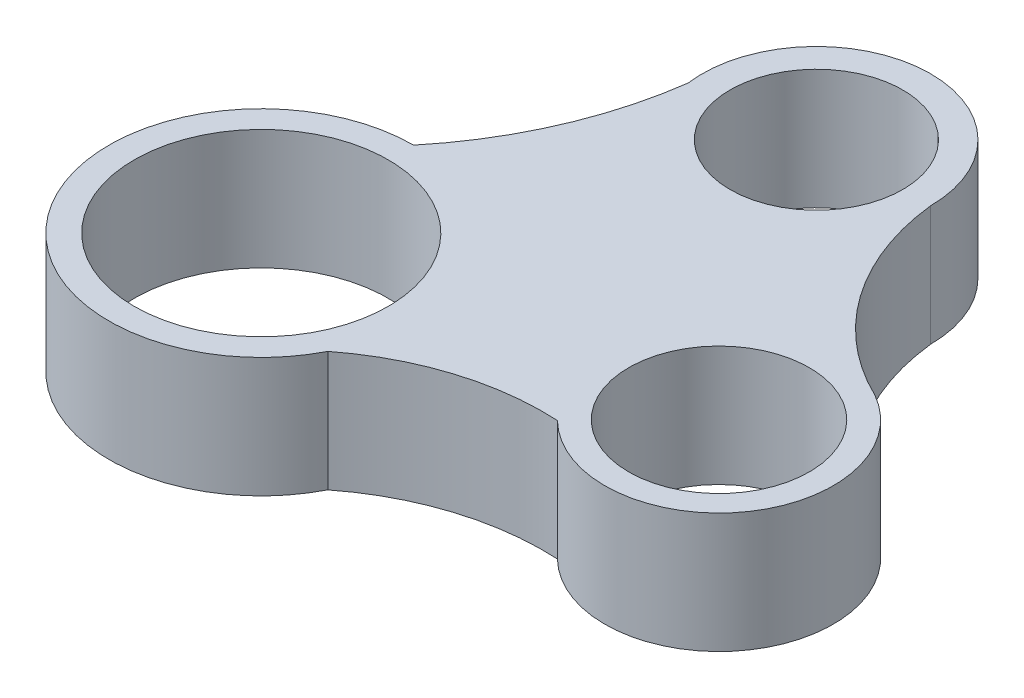
ISO-10303-21;
HEADER;
FILE_DESCRIPTION(('STEP AP214'),'2;1');
FILE_NAME('part.step','',(''),(''),'','','');
FILE_SCHEMA(('AUTOMOTIVE_DESIGN { 1 0 10303 214 1 1 1 1 }'));
ENDSEC;
DATA;
#1=APPLICATION_CONTEXT('core data for automotive mechanical design processes');
#2=APPLICATION_PROTOCOL_DEFINITION('international standard','automotive_design',2000,#1);
#3=PRODUCT_CONTEXT('',#1,'mechanical');
#4=PRODUCT('Part','Part','',(#3));
#5=PRODUCT_RELATED_PRODUCT_CATEGORY('part','',(#4));
#6=PRODUCT_DEFINITION_FORMATION('','',#4);
#7=PRODUCT_DEFINITION_CONTEXT('part definition',#1,'design');
#8=PRODUCT_DEFINITION('design','',#6,#7);
#9=PRODUCT_DEFINITION_SHAPE('','',#8);
#10=(LENGTH_UNIT() NAMED_UNIT(*) SI_UNIT(.MILLI.,.METRE.));
#11=(NAMED_UNIT(*) PLANE_ANGLE_UNIT() SI_UNIT($,.RADIAN.));
#12=(NAMED_UNIT(*) SI_UNIT($,.STERADIAN.) SOLID_ANGLE_UNIT());
#13=UNCERTAINTY_MEASURE_WITH_UNIT(LENGTH_MEASURE(1.E-05),#10,'distance_accuracy_value','');
#14=(GEOMETRIC_REPRESENTATION_CONTEXT(3) GLOBAL_UNCERTAINTY_ASSIGNED_CONTEXT((#13)) GLOBAL_UNIT_ASSIGNED_CONTEXT((#10,
#11,#12)) REPRESENTATION_CONTEXT('',''));
#15=CARTESIAN_POINT('',(0.,0.,0.));
#16=DIRECTION('',(0.,0.,1.));
#17=DIRECTION('',(1.,0.,0.));
#18=AXIS2_PLACEMENT_3D('',#15,#16,#17);
#19=CARTESIAN_POINT('',(-24.4218345166872,10.,-32.8570012060377));
#20=DIRECTION('',(0.,-1.,0.));
#21=DIRECTION('',(0.,0.,-1.));
#22=AXIS2_PLACEMENT_3D('',#19,#20,#21);
#23=CYLINDRICAL_SURFACE('',#22,31.6659233053556);
#24=CARTESIAN_POINT('',(-24.4218345166872,0.,-32.8570012060377));
#25=DIRECTION('',(0.,1.,0.));
#26=DIRECTION('',(0.,0.,1.));
#27=AXIS2_PLACEMENT_3D('',#24,#25,#26);
#28=CIRCLE('',#27,31.6659233053556);
#29=CARTESIAN_POINT('',(6.95939174308019,0.,-28.6203353926951));
#30=VERTEX_POINT('',#29);
#31=CARTESIAN_POINT('',(0.,0.,-12.7));
#32=VERTEX_POINT('',#31);
#33=EDGE_CURVE('E140',#30,#32,#28,.F.);
#34=ORIENTED_EDGE('',*,*,#33,.T.);
#35=DIRECTION('',(0.,-1.,0.));
#36=VECTOR('',#35,1.);
#37=CARTESIAN_POINT('',(0.,10.,-12.7));
#38=LINE('',#37,#36);
#39=CARTESIAN_POINT('',(0.,10.,-12.7));
#40=VERTEX_POINT('',#39);
#41=EDGE_CURVE('E11',#40,#32,#38,.T.);
#42=ORIENTED_EDGE('',*,*,#41,.F.);
#43=CARTESIAN_POINT('',(-24.4218345166872,10.,-32.8570012060377));
#44=DIRECTION('',(0.,1.,0.));
#45=DIRECTION('',(0.,0.,1.));
#46=AXIS2_PLACEMENT_3D('',#43,#44,#45);
#47=CIRCLE('',#46,31.6659233053556);
#48=CARTESIAN_POINT('',(6.95939174308019,10.,-28.6203353926951));
#49=VERTEX_POINT('',#48);
#50=EDGE_CURVE('E169',#49,#40,#47,.F.);
#51=ORIENTED_EDGE('',*,*,#50,.F.);
#52=DIRECTION('',(0.,-1.,0.));
#53=VECTOR('',#52,1.);
#54=CARTESIAN_POINT('',(6.95939174308019,10.,-28.6203353926951));
#55=LINE('',#54,#53);
#56=EDGE_CURVE('E139',#49,#30,#55,.T.);
#57=ORIENTED_EDGE('',*,*,#56,.T.);
#58=EDGE_LOOP('',(#34,#42,#51,#57));
#59=FACE_BOUND('',#58,.T.);
#60=ADVANCED_FACE('F39',(#59),#23,.F.);
#61=CARTESIAN_POINT('',(0.,10.,0.));
#62=DIRECTION('',(0.,-1.,0.));
#63=DIRECTION('',(0.,0.,-1.));
#64=AXIS2_PLACEMENT_3D('',#61,#62,#63);
#65=CYLINDRICAL_SURFACE('',#64,12.7);
#66=CARTESIAN_POINT('',(0.,0.,0.));
#67=DIRECTION('',(0.,1.,0.));
#68=DIRECTION('',(0.,0.,1.));
#69=AXIS2_PLACEMENT_3D('',#66,#67,#68);
#70=CIRCLE('',#69,12.7);
#71=CARTESIAN_POINT('',(11.3157903638749,0.,5.76566461397434));
#72=VERTEX_POINT('',#71);
#73=EDGE_CURVE('E144',#32,#72,#70,.T.);
#74=ORIENTED_EDGE('',*,*,#73,.T.);
#75=DIRECTION('',(0.,-1.,0.));
#76=VECTOR('',#75,1.);
#77=CARTESIAN_POINT('',(11.3157903638749,10.,5.76566461397434));
#78=LINE('',#77,#76);
#79=CARTESIAN_POINT('',(11.3157903638749,10.,5.76566461397434));
#80=VERTEX_POINT('',#79);
#81=EDGE_CURVE('E48',#80,#72,#78,.T.);
#82=ORIENTED_EDGE('',*,*,#81,.F.);
#83=CARTESIAN_POINT('',(0.,10.,0.));
#84=DIRECTION('',(0.,1.,0.));
#85=DIRECTION('',(0.,0.,1.));
#86=AXIS2_PLACEMENT_3D('',#83,#84,#85);
#87=CIRCLE('',#86,12.7);
#88=EDGE_CURVE('E89',#40,#80,#87,.T.);
#89=ORIENTED_EDGE('',*,*,#88,.F.);
#90=ORIENTED_EDGE('',*,*,#41,.T.);
#91=EDGE_LOOP('',(#74,#82,#89,#90));
#92=FACE_BOUND('',#91,.T.);
#93=ADVANCED_FACE('F203',(#92),#65,.T.);
#94=CARTESIAN_POINT('',(24.6946754383705,10.,22.8627472391993));
#95=DIRECTION('',(0.,-1.,0.));
#96=DIRECTION('',(0.,0.,-1.));
#97=AXIS2_PLACEMENT_3D('',#94,#95,#96);
#98=CYLINDRICAL_SURFACE('',#97,21.7095555028271);
#99=CARTESIAN_POINT('',(24.6946754383705,0.,22.8627472391993));
#100=DIRECTION('',(0.,1.,0.));
#101=DIRECTION('',(0.,0.,1.));
#102=AXIS2_PLACEMENT_3D('',#99,#100,#101);
#103=CIRCLE('',#102,21.7095555028271);
#104=CARTESIAN_POINT('',(25.8771808449846,0.,1.18542081056288));
#105=VERTEX_POINT('',#104);
#106=EDGE_CURVE('E147',#72,#105,#103,.F.);
#107=ORIENTED_EDGE('',*,*,#106,.T.);
#108=DIRECTION('',(0.,-1.,0.));
#109=VECTOR('',#108,1.);
#110=CARTESIAN_POINT('',(25.8771808449846,10.,1.18542081056288));
#111=LINE('',#110,#109);
#112=CARTESIAN_POINT('',(25.8771808449846,10.,1.18542081056288));
#113=VERTEX_POINT('',#112);
#114=EDGE_CURVE('E118',#113,#105,#111,.T.);
#115=ORIENTED_EDGE('',*,*,#114,.F.);
#116=CARTESIAN_POINT('',(24.6946754383705,10.,22.8627472391993));
#117=DIRECTION('',(0.,1.,0.));
#118=DIRECTION('',(0.,0.,1.));
#119=AXIS2_PLACEMENT_3D('',#116,#117,#118);
#120=CIRCLE('',#119,21.7095555028271);
#121=EDGE_CURVE('E103',#80,#113,#120,.F.);
#122=ORIENTED_EDGE('',*,*,#121,.F.);
#123=ORIENTED_EDGE('',*,*,#81,.T.);
#124=EDGE_LOOP('',(#107,#115,#122,#123));
#125=FACE_BOUND('',#124,.T.);
#126=ADVANCED_FACE('F179',(#125),#98,.F.);
#127=CARTESIAN_POINT('',(32.5599613547654,10.,-5.60177814468323));
#128=DIRECTION('',(0.,-1.,0.));
#129=DIRECTION('',(0.,0.,-1.));
#130=AXIS2_PLACEMENT_3D('',#127,#128,#129);
#131=CYLINDRICAL_SURFACE('',#130,9.525);
#132=CARTESIAN_POINT('',(32.5599613547654,0.,-5.60177814468323));
#133=DIRECTION('',(0.,1.,0.));
#134=DIRECTION('',(0.,0.,1.));
#135=AXIS2_PLACEMENT_3D('',#132,#133,#134);
#136=CIRCLE('',#135,9.525);
#137=CARTESIAN_POINT('',(37.2856847426142,0.,-13.8717940734187));
#138=VERTEX_POINT('',#137);
#139=EDGE_CURVE('E113',#105,#138,#136,.T.);
#140=ORIENTED_EDGE('',*,*,#139,.T.);
#141=DIRECTION('',(0.,-1.,0.));
#142=VECTOR('',#141,1.);
#143=CARTESIAN_POINT('',(37.2856847426142,10.,-13.8717940734187));
#144=LINE('',#143,#142);
#145=CARTESIAN_POINT('',(37.2856847426142,10.,-13.8717940734187));
#146=VERTEX_POINT('',#145);
#147=EDGE_CURVE('E110',#146,#138,#144,.T.);
#148=ORIENTED_EDGE('',*,*,#147,.F.);
#149=CARTESIAN_POINT('',(32.5599613547654,10.,-5.60177814468323));
#150=DIRECTION('',(0.,1.,0.));
#151=DIRECTION('',(0.,0.,1.));
#152=AXIS2_PLACEMENT_3D('',#149,#150,#151);
#153=CIRCLE('',#152,9.525);
#154=EDGE_CURVE('E96',#113,#146,#153,.T.);
#155=ORIENTED_EDGE('',*,*,#154,.F.);
#156=ORIENTED_EDGE('',*,*,#114,.T.);
#157=EDGE_LOOP('',(#140,#148,#155,#156));
#158=FACE_BOUND('',#157,.T.);
#159=ADVANCED_FACE('F111',(#158),#131,.T.);
#160=CARTESIAN_POINT('',(46.0414826946628,10.,-32.1199803910774));
#161=DIRECTION('',(0.,-1.,0.));
#162=DIRECTION('',(0.,0.,-1.));
#163=AXIS2_PLACEMENT_3D('',#160,#161,#162);
#164=CYLINDRICAL_SURFACE('',#163,20.2400667405294);
#165=CARTESIAN_POINT('',(46.0414826946628,0.,-32.1199803910774));
#166=DIRECTION('',(0.,1.,0.));
#167=DIRECTION('',(0.,0.,1.));
#168=AXIS2_PLACEMENT_3D('',#165,#166,#167);
#169=CIRCLE('',#168,20.2400667405294);
#170=CARTESIAN_POINT('',(25.9258374970823,0.,-29.879194826562));
#171=VERTEX_POINT('',#170);
#172=EDGE_CURVE('E152',#171,#138,#169,.T.);
#173=ORIENTED_EDGE('',*,*,#172,.F.);
#174=DIRECTION('',(0.,-1.,0.));
#175=VECTOR('',#174,1.);
#176=CARTESIAN_POINT('',(25.9258374970823,10.,-29.879194826562));
#177=LINE('',#176,#175);
#178=CARTESIAN_POINT('',(25.9258374970823,10.,-29.879194826562));
#179=VERTEX_POINT('',#178);
#180=EDGE_CURVE('E78',#179,#171,#177,.T.);
#181=ORIENTED_EDGE('',*,*,#180,.F.);
#182=CARTESIAN_POINT('',(46.0414826946628,10.,-32.1199803910774));
#183=DIRECTION('',(0.,1.,0.));
#184=DIRECTION('',(0.,0.,1.));
#185=AXIS2_PLACEMENT_3D('',#182,#183,#184);
#186=CIRCLE('',#185,20.2400667405294);
#187=EDGE_CURVE('E101',#179,#146,#186,.T.);
#188=ORIENTED_EDGE('',*,*,#187,.T.);
#189=ORIENTED_EDGE('',*,*,#147,.T.);
#190=EDGE_LOOP('',(#173,#181,#188,#189));
#191=FACE_BOUND('',#190,.T.);
#192=ADVANCED_FACE('F120',(#191),#164,.F.);
#193=CARTESIAN_POINT('',(32.5599613547654,10.,-5.60177814468323));
#194=DIRECTION('',(0.,-1.,0.));
#195=DIRECTION('',(0.,0.,-1.));
#196=AXIS2_PLACEMENT_3D('',#193,#194,#195);
#197=CYLINDRICAL_SURFACE('',#196,7.53178847796581);
#198=CARTESIAN_POINT('',(32.5599613547654,10.,-5.60177814468323));
#199=DIRECTION('',(0.,1.,0.));
#200=DIRECTION('',(0.,0.,1.));
#201=AXIS2_PLACEMENT_3D('',#198,#199,#200);
#202=CIRCLE('',#201,7.53178847796581);
#203=CARTESIAN_POINT('',(32.5599613547654,10.,1.93001033328258));
#204=VERTEX_POINT('',#203);
#205=EDGE_CURVE('E131',#204,#204,#202,.T.);
#206=ORIENTED_EDGE('',*,*,#205,.T.);
#207=EDGE_LOOP('',(#206));
#208=FACE_BOUND('',#207,.T.);
#209=CARTESIAN_POINT('',(32.5599613547654,0.,-5.60177814468323));
#210=DIRECTION('',(0.,1.,0.));
#211=DIRECTION('',(0.,0.,1.));
#212=AXIS2_PLACEMENT_3D('',#209,#210,#211);
#213=CIRCLE('',#212,7.53178847796581);
#214=CARTESIAN_POINT('',(32.5599613547654,0.,1.93001033328258));
#215=VERTEX_POINT('',#214);
#216=EDGE_CURVE('E161',#215,#215,#213,.T.);
#217=ORIENTED_EDGE('',*,*,#216,.F.);
#218=EDGE_LOOP('',(#217));
#219=FACE_BOUND('',#218,.T.);
#220=ADVANCED_FACE('F198',(#208,#219),#197,.F.);
#221=CARTESIAN_POINT('',(16.4008374970823,10.,-29.879194826562));
#222=DIRECTION('',(0.,-1.,0.));
#223=DIRECTION('',(0.,0.,-1.));
#224=AXIS2_PLACEMENT_3D('',#221,#222,#223);
#225=CYLINDRICAL_SURFACE('',#224,7.19948063206231);
#226=CARTESIAN_POINT('',(16.4008374970823,10.,-29.879194826562));
#227=DIRECTION('',(0.,1.,0.));
#228=DIRECTION('',(0.,0.,1.));
#229=AXIS2_PLACEMENT_3D('',#226,#227,#228);
#230=CIRCLE('',#229,7.19948063206231);
#231=CARTESIAN_POINT('',(16.4008374970823,10.,-22.6797141944997));
#232=VERTEX_POINT('',#231);
#233=EDGE_CURVE('E124',#232,#232,#230,.T.);
#234=ORIENTED_EDGE('',*,*,#233,.T.);
#235=EDGE_LOOP('',(#234));
#236=FACE_BOUND('',#235,.T.);
#237=CARTESIAN_POINT('',(16.4008374970823,0.,-29.879194826562));
#238=DIRECTION('',(0.,1.,0.));
#239=DIRECTION('',(0.,0.,1.));
#240=AXIS2_PLACEMENT_3D('',#237,#238,#239);
#241=CIRCLE('',#240,7.19948063206231);
#242=CARTESIAN_POINT('',(16.4008374970823,0.,-22.6797141944997));
#243=VERTEX_POINT('',#242);
#244=EDGE_CURVE('E157',#243,#243,#241,.T.);
#245=ORIENTED_EDGE('',*,*,#244,.F.);
#246=EDGE_LOOP('',(#245));
#247=FACE_BOUND('',#246,.T.);
#248=ADVANCED_FACE('F190',(#236,#247),#225,.F.);
#249=CARTESIAN_POINT('',(16.4008374970823,10.,-29.879194826562));
#250=DIRECTION('',(0.,-1.,0.));
#251=DIRECTION('',(0.,0.,-1.));
#252=AXIS2_PLACEMENT_3D('',#249,#250,#251);
#253=CYLINDRICAL_SURFACE('',#252,9.525);
#254=CARTESIAN_POINT('',(16.4008374970823,0.,-29.879194826562));
#255=DIRECTION('',(0.,1.,0.));
#256=DIRECTION('',(0.,0.,1.));
#257=AXIS2_PLACEMENT_3D('',#254,#255,#256);
#258=CIRCLE('',#257,9.525);
#259=EDGE_CURVE('E81',#171,#30,#258,.T.);
#260=ORIENTED_EDGE('',*,*,#259,.T.);
#261=ORIENTED_EDGE('',*,*,#56,.F.);
#262=CARTESIAN_POINT('',(16.4008374970823,10.,-29.879194826562));
#263=DIRECTION('',(0.,1.,0.));
#264=DIRECTION('',(0.,0.,1.));
#265=AXIS2_PLACEMENT_3D('',#262,#263,#264);
#266=CIRCLE('',#265,9.525);
#267=EDGE_CURVE('E56',#179,#49,#266,.T.);
#268=ORIENTED_EDGE('',*,*,#267,.F.);
#269=ORIENTED_EDGE('',*,*,#180,.T.);
#270=EDGE_LOOP('',(#260,#261,#268,#269));
#271=FACE_BOUND('',#270,.T.);
#272=ADVANCED_FACE('F187',(#271),#253,.T.);
#273=CARTESIAN_POINT('',(0.,10.,0.));
#274=DIRECTION('',(0.,-1.,0.));
#275=DIRECTION('',(0.,0.,-1.));
#276=AXIS2_PLACEMENT_3D('',#273,#274,#275);
#277=CYLINDRICAL_SURFACE('',#276,10.5878824348253);
#278=CARTESIAN_POINT('',(0.,10.,0.));
#279=DIRECTION('',(0.,1.,0.));
#280=DIRECTION('',(0.,0.,1.));
#281=AXIS2_PLACEMENT_3D('',#278,#279,#280);
#282=CIRCLE('',#281,10.5878824348253);
#283=CARTESIAN_POINT('',(0.,10.,10.5878824348253));
#284=VERTEX_POINT('',#283);
#285=EDGE_CURVE('E135',#284,#284,#282,.T.);
#286=ORIENTED_EDGE('',*,*,#285,.T.);
#287=EDGE_LOOP('',(#286));
#288=FACE_BOUND('',#287,.T.);
#289=CARTESIAN_POINT('',(0.,0.,0.));
#290=DIRECTION('',(0.,1.,0.));
#291=DIRECTION('',(0.,0.,1.));
#292=AXIS2_PLACEMENT_3D('',#289,#290,#291);
#293=CIRCLE('',#292,10.5878824348253);
#294=CARTESIAN_POINT('',(0.,0.,10.5878824348253));
#295=VERTEX_POINT('',#294);
#296=EDGE_CURVE('E165',#295,#295,#293,.T.);
#297=ORIENTED_EDGE('',*,*,#296,.F.);
#298=EDGE_LOOP('',(#297));
#299=FACE_BOUND('',#298,.T.);
#300=ADVANCED_FACE('F189',(#288,#299),#277,.F.);
#301=CARTESIAN_POINT('',(0.,10.,0.));
#302=DIRECTION('',(0.,1.,0.));
#303=DIRECTION('',(0.,0.,1.));
#304=AXIS2_PLACEMENT_3D('',#301,#302,#303);
#305=PLANE('',#304);
#306=ORIENTED_EDGE('',*,*,#50,.T.);
#307=ORIENTED_EDGE('',*,*,#88,.T.);
#308=ORIENTED_EDGE('',*,*,#121,.T.);
#309=ORIENTED_EDGE('',*,*,#154,.T.);
#310=ORIENTED_EDGE('',*,*,#187,.F.);
#311=ORIENTED_EDGE('',*,*,#267,.T.);
#312=EDGE_LOOP('',(#306,#307,#308,#309,#310,#311));
#313=FACE_BOUND('',#312,.T.);
#314=ORIENTED_EDGE('',*,*,#233,.F.);
#315=EDGE_LOOP('',(#314));
#316=FACE_BOUND('',#315,.T.);
#317=ORIENTED_EDGE('',*,*,#205,.F.);
#318=EDGE_LOOP('',(#317));
#319=FACE_BOUND('',#318,.T.);
#320=ORIENTED_EDGE('',*,*,#285,.F.);
#321=EDGE_LOOP('',(#320));
#322=FACE_BOUND('',#321,.T.);
#323=ADVANCED_FACE('F98',(#313,#316,#319,#322),#305,.T.);
#324=CARTESIAN_POINT('',(0.,0.,0.));
#325=DIRECTION('',(0.,1.,0.));
#326=DIRECTION('',(0.,0.,1.));
#327=AXIS2_PLACEMENT_3D('',#324,#325,#326);
#328=PLANE('',#327);
#329=ORIENTED_EDGE('',*,*,#33,.F.);
#330=ORIENTED_EDGE('',*,*,#259,.F.);
#331=ORIENTED_EDGE('',*,*,#172,.T.);
#332=ORIENTED_EDGE('',*,*,#139,.F.);
#333=ORIENTED_EDGE('',*,*,#106,.F.);
#334=ORIENTED_EDGE('',*,*,#73,.F.);
#335=EDGE_LOOP('',(#329,#330,#331,#332,#333,#334));
#336=FACE_BOUND('',#335,.T.);
#337=ORIENTED_EDGE('',*,*,#244,.T.);
#338=EDGE_LOOP('',(#337));
#339=FACE_BOUND('',#338,.T.);
#340=ORIENTED_EDGE('',*,*,#216,.T.);
#341=EDGE_LOOP('',(#340));
#342=FACE_BOUND('',#341,.T.);
#343=ORIENTED_EDGE('',*,*,#296,.T.);
#344=EDGE_LOOP('',(#343));
#345=FACE_BOUND('',#344,.T.);
#346=ADVANCED_FACE('F182',(#336,#339,#342,#345),#328,.F.);
#347=CLOSED_SHELL('',(#60,#93,#126,#159,#192,#220,#248,#272,#300,#323,#346));
#348=MANIFOLD_SOLID_BREP('B2',#347);
#349=ADVANCED_BREP_SHAPE_REPRESENTATION('',(#18,#348),#14);
#350=SHAPE_DEFINITION_REPRESENTATION(#9,#349);
ENDSEC;
END-ISO-10303-21;
